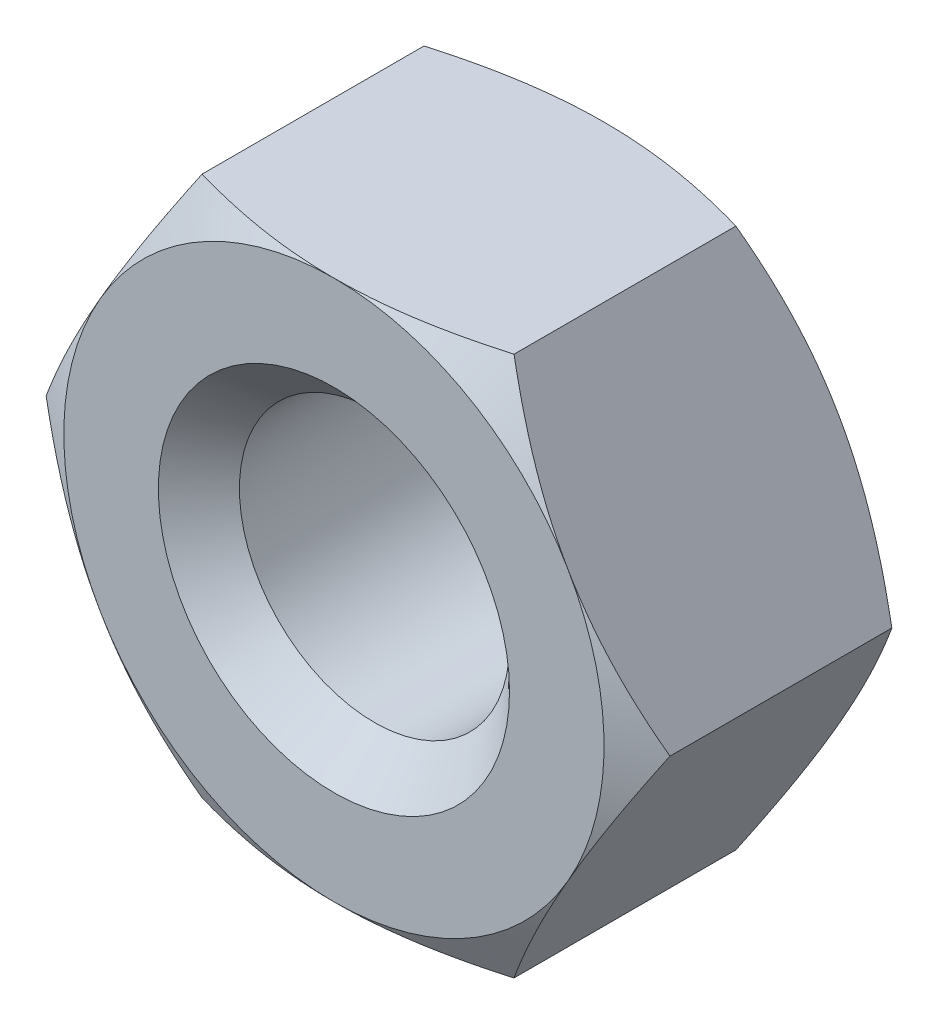
ISO-10303-21;
HEADER;
FILE_DESCRIPTION(('STEP AP214'),'2;1');
FILE_NAME('part.step','',(''),(''),'','','');
FILE_SCHEMA(('AUTOMOTIVE_DESIGN { 1 0 10303 214 1 1 1 1 }'));
ENDSEC;
DATA;
#1=APPLICATION_CONTEXT('core data for automotive mechanical design processes');
#2=APPLICATION_PROTOCOL_DEFINITION('international standard','automotive_design',2000,#1);
#3=PRODUCT_CONTEXT('',#1,'mechanical');
#4=PRODUCT('Part','Part','',(#3));
#5=PRODUCT_RELATED_PRODUCT_CATEGORY('part','',(#4));
#6=PRODUCT_DEFINITION_FORMATION('','',#4);
#7=PRODUCT_DEFINITION_CONTEXT('part definition',#1,'design');
#8=PRODUCT_DEFINITION('design','',#6,#7);
#9=PRODUCT_DEFINITION_SHAPE('','',#8);
#10=(LENGTH_UNIT() NAMED_UNIT(*) SI_UNIT(.MILLI.,.METRE.));
#11=(NAMED_UNIT(*) PLANE_ANGLE_UNIT() SI_UNIT($,.RADIAN.));
#12=(NAMED_UNIT(*) SI_UNIT($,.STERADIAN.) SOLID_ANGLE_UNIT());
#13=UNCERTAINTY_MEASURE_WITH_UNIT(LENGTH_MEASURE(1.E-05),#10,'distance_accuracy_value','');
#14=(GEOMETRIC_REPRESENTATION_CONTEXT(3) GLOBAL_UNCERTAINTY_ASSIGNED_CONTEXT((#13)) GLOBAL_UNIT_ASSIGNED_CONTEXT((#10,
#11,#12)) REPRESENTATION_CONTEXT('',''));
#15=CARTESIAN_POINT('',(0.,0.,0.));
#16=DIRECTION('',(0.,0.,1.));
#17=DIRECTION('',(1.,0.,0.));
#18=AXIS2_PLACEMENT_3D('',#15,#16,#17);
#19=CARTESIAN_POINT('',(2.3094010767585,-4.,4.));
#20=DIRECTION('',(-0.866025403784439,0.5,0.));
#21=DIRECTION('',(-0.5,-0.866025403784439,0.));
#22=AXIS2_PLACEMENT_3D('',#19,#20,#21);
#23=PLANE('',#22);
#24=CARTESIAN_POINT('',(2.30928560670467,-4.0002,3.64266774092523));
#25=CARTESIAN_POINT('',(2.41077174646171,-3.82442084967678,3.70128212635172));
#26=CARTESIAN_POINT('',(2.513133908835,-3.64712438367362,3.75458967853774));
#27=CARTESIAN_POINT('',(2.71963072479812,-3.2894614068243,3.8476383292536));
#28=CARTESIAN_POINT('',(2.82376904741904,-3.10908854102985,3.8873465109703));
#29=CARTESIAN_POINT('',(3.03075510011795,-2.75057818129721,3.94915778471972));
#30=CARTESIAN_POINT('',(3.13357098372492,-2.57249584706486,3.97167226847711));
#31=CARTESIAN_POINT('',(3.33968651028529,-2.21549328283349,3.99854937685342));
#32=CARTESIAN_POINT('',(3.44298540411434,-2.0365743503559,4.00293425857306));
#33=CARTESIAN_POINT('',(3.63600352522933,-1.70225715780327,3.99380992706003));
#34=CARTESIAN_POINT('',(3.72575165335065,-1.54680884001293,3.98254104601201));
#35=CARTESIAN_POINT('',(3.90466320392055,-1.23692494436494,3.94682600920181));
#36=CARTESIAN_POINT('',(3.99382600759479,-1.08249043825587,3.92236765428847));
#37=CARTESIAN_POINT('',(4.17310641015197,-0.771967672225422,3.86122393508071));
#38=CARTESIAN_POINT('',(4.26320131938131,-0.615918711936898,3.82427939634514));
#39=CARTESIAN_POINT('',(4.44204742827551,-0.30614816459616,3.74042992745197));
#40=CARTESIAN_POINT('',(4.53080091904967,-0.15242260922622,3.69354469778726));
#41=CARTESIAN_POINT('',(4.61891762357085,0.000200000000000362,3.64266774092523));
#42=B_SPLINE_CURVE_WITH_KNOTS('',3,(#24,#25,#26,#27,#28,#29,#30,#31,#32,#33,#34,#35,#36,#37,#38,
#39,#40,#41),.UNSPECIFIED.,.F.,.F.,(4,2,2,2,2,2,2,2,4),(0.,0.634047835695967,1.26961969224544,
1.88946157213122,2.50854226669297,3.04757825393386,3.58711366126904,4.13861653143764,
4.68903648037744),.UNSPECIFIED.);
#43=CARTESIAN_POINT('',(2.30940107675851,-4.,3.64273441009184));
#44=VERTEX_POINT('',#43);
#45=CARTESIAN_POINT('',(3.46410161513776,-2.,4.));
#46=VERTEX_POINT('',#45);
#47=EDGE_CURVE('E375',#44,#46,#42,.T.);
#48=ORIENTED_EDGE('',*,*,#47,.F.);
#49=DIRECTION('',(0.,0.,-1.));
#50=VECTOR('',#49,1.);
#51=CARTESIAN_POINT('',(2.3094010767585,-4.,4.));
#52=LINE('',#51,#50);
#53=CARTESIAN_POINT('',(2.3094010767585,-4.,0.357265589908162));
#54=VERTEX_POINT('',#53);
#55=EDGE_CURVE('E330',#44,#54,#52,.T.);
#56=ORIENTED_EDGE('',*,*,#55,.T.);
#57=CARTESIAN_POINT('',(4.61891762357085,0.000200000000000434,0.357332259074766));
#58=CARTESIAN_POINT('',(4.51743148381381,-0.175579150323228,0.298717873648282));
#59=CARTESIAN_POINT('',(4.41506932144052,-0.352875616326381,0.245410321462262));
#60=CARTESIAN_POINT('',(4.2085725054774,-0.710538593175707,0.152361670746403));
#61=CARTESIAN_POINT('',(4.10443418285647,-0.890911458970152,0.112653489029703));
#62=CARTESIAN_POINT('',(3.89744813015756,-1.24942181870279,0.0508422152802782));
#63=CARTESIAN_POINT('',(3.7946322465506,-1.42750415293514,0.028327731522888));
#64=CARTESIAN_POINT('',(3.58851671999023,-1.78450671716651,0.00145062314658105));
#65=CARTESIAN_POINT('',(3.48521782616117,-1.9634256496441,-0.00293425857305752));
#66=CARTESIAN_POINT('',(3.29219970504619,-2.29774284219673,0.00619007293996952));
#67=CARTESIAN_POINT('',(3.20245157692487,-2.45319115998707,0.0174589539879935));
#68=CARTESIAN_POINT('',(3.02354002635497,-2.76307505563506,0.0531739907981925));
#69=CARTESIAN_POINT('',(2.93437722268073,-2.91750956174413,0.0776323457115324));
#70=CARTESIAN_POINT('',(2.75509682012354,-3.22803232777458,0.138776064919289));
#71=CARTESIAN_POINT('',(2.6650019108942,-3.38408128806311,0.175720603654863));
#72=CARTESIAN_POINT('',(2.48615580200001,-3.69385183540384,0.259570072548026));
#73=CARTESIAN_POINT('',(2.39740231122585,-3.84757739077378,0.306455302212739));
#74=CARTESIAN_POINT('',(2.30928560670467,-4.0002,0.357332259074766));
#75=B_SPLINE_CURVE_WITH_KNOTS('',3,(#57,#58,#59,#60,#61,#62,#63,#64,#65,#66,#67,#68,#69,#70,#71,
#72,#73,#74),.UNSPECIFIED.,.F.,.F.,(4,2,2,2,2,2,2,2,4),(0.,0.634047835695967,1.26961969224543,
1.88946157213122,2.50854226669297,3.04757825393386,3.58711366126904,4.13861653143764,
4.68903648037744),.UNSPECIFIED.);
#76=CARTESIAN_POINT('',(3.46410161513776,-2.,0.));
#77=VERTEX_POINT('',#76);
#78=EDGE_CURVE('E268',#77,#54,#75,.T.);
#79=ORIENTED_EDGE('',*,*,#78,.F.);
#80=CARTESIAN_POINT('',(4.61880215351701,0.,0.357265589908162));
#81=VERTEX_POINT('',#80);
#82=EDGE_CURVE('E277',#81,#77,#75,.T.);
#83=ORIENTED_EDGE('',*,*,#82,.F.);
#84=DIRECTION('',(0.,0.,-1.));
#85=VECTOR('',#84,1.);
#86=CARTESIAN_POINT('',(4.61880215351701,0.,4.));
#87=LINE('',#86,#85);
#88=CARTESIAN_POINT('',(4.61880215351701,0.,3.64273441009184));
#89=VERTEX_POINT('',#88);
#90=EDGE_CURVE('E321',#89,#81,#87,.T.);
#91=ORIENTED_EDGE('',*,*,#90,.F.);
#92=EDGE_CURVE('E226',#46,#89,#42,.T.);
#93=ORIENTED_EDGE('',*,*,#92,.F.);
#94=EDGE_LOOP('',(#48,#56,#79,#83,#91,#93));
#95=FACE_BOUND('',#94,.T.);
#96=ADVANCED_FACE('F71',(#95),#23,.F.);
#97=CARTESIAN_POINT('',(4.61880215351701,0.,4.));
#98=DIRECTION('',(-0.866025403784439,-0.5,0.));
#99=DIRECTION('',(0.5,-0.866025403784439,0.));
#100=AXIS2_PLACEMENT_3D('',#97,#98,#99);
#101=PLANE('',#100);
#102=CARTESIAN_POINT('',(4.61891762357085,-0.000199999999999605,3.64266774092523));
#103=CARTESIAN_POINT('',(4.51743148381381,0.175579150323228,3.70128212635172));
#104=CARTESIAN_POINT('',(4.41506932144052,0.352875616326382,3.75458967853774));
#105=CARTESIAN_POINT('',(4.2085725054774,0.710538593175708,3.8476383292536));
#106=CARTESIAN_POINT('',(4.10443418285647,0.890911458970153,3.8873465109703));
#107=CARTESIAN_POINT('',(3.89744813015756,1.24942181870279,3.94915778471972));
#108=CARTESIAN_POINT('',(3.7946322465506,1.42750415293514,3.97167226847711));
#109=CARTESIAN_POINT('',(3.58851671999023,1.78450671716651,3.99854937685342));
#110=CARTESIAN_POINT('',(3.48521782616117,1.9634256496441,4.00293425857306));
#111=CARTESIAN_POINT('',(3.29219970504619,2.29774284219673,3.99380992706003));
#112=CARTESIAN_POINT('',(3.20245157692487,2.45319115998707,3.98254104601201));
#113=CARTESIAN_POINT('',(3.02354002635497,2.76307505563506,3.94682600920181));
#114=CARTESIAN_POINT('',(2.93437722268073,2.91750956174413,3.92236765428847));
#115=CARTESIAN_POINT('',(2.75509682012354,3.22803232777458,3.86122393508071));
#116=CARTESIAN_POINT('',(2.6650019108942,3.38408128806311,3.82427939634514));
#117=CARTESIAN_POINT('',(2.48615580200001,3.69385183540384,3.74042992745197));
#118=CARTESIAN_POINT('',(2.39740231122585,3.84757739077378,3.69354469778726));
#119=CARTESIAN_POINT('',(2.30928560670467,4.0002,3.64266774092523));
#120=B_SPLINE_CURVE_WITH_KNOTS('',3,(#102,#103,#104,#105,#106,#107,#108,#109,#110,#111,#112,
#113,#114,#115,#116,#117,#118,#119),.UNSPECIFIED.,.F.,.F.,(4,2,2,2,2,2,2,2,4),(0.,
0.634047835695967,1.26961969224544,1.88946157213122,2.50854226669297,3.04757825393386,
3.58711366126904,4.13861653143764,4.68903648037744),.UNSPECIFIED.);
#121=CARTESIAN_POINT('',(3.46410161513776,2.,4.));
#122=VERTEX_POINT('',#121);
#123=EDGE_CURVE('E378',#89,#122,#120,.T.);
#124=ORIENTED_EDGE('',*,*,#123,.F.);
#125=ORIENTED_EDGE('',*,*,#90,.T.);
#126=CARTESIAN_POINT('',(2.30928560670467,4.0002,0.357332259074766));
#127=CARTESIAN_POINT('',(2.41077174646171,3.82442084967678,0.298717873648282));
#128=CARTESIAN_POINT('',(2.513133908835,3.64712438367362,0.245410321462262));
#129=CARTESIAN_POINT('',(2.71963072479812,3.2894614068243,0.152361670746403));
#130=CARTESIAN_POINT('',(2.82376904741904,3.10908854102985,0.112653489029704));
#131=CARTESIAN_POINT('',(3.03075510011795,2.75057818129721,0.0508422152802785));
#132=CARTESIAN_POINT('',(3.13357098372492,2.57249584706486,0.0283277315228884));
#133=CARTESIAN_POINT('',(3.33968651028529,2.21549328283349,0.00145062314658142));
#134=CARTESIAN_POINT('',(3.44298540411434,2.0365743503559,-0.00293425857305715));
#135=CARTESIAN_POINT('',(3.63600352522933,1.70225715780327,0.00619007293996989));
#136=CARTESIAN_POINT('',(3.72575165335065,1.54680884001294,0.0174589539879938));
#137=CARTESIAN_POINT('',(3.90466320392055,1.23692494436495,0.0531739907981925));
#138=CARTESIAN_POINT('',(3.99382600759479,1.08249043825587,0.0776323457115322));
#139=CARTESIAN_POINT('',(4.17310641015197,0.771967672225423,0.138776064919288));
#140=CARTESIAN_POINT('',(4.26320131938131,0.615918711936898,0.175720603654863));
#141=CARTESIAN_POINT('',(4.44204742827551,0.306148164596161,0.259570072548026));
#142=CARTESIAN_POINT('',(4.53080091904967,0.152422609226221,0.306455302212739));
#143=CARTESIAN_POINT('',(4.61891762357085,-0.000199999999999611,0.357332259074766));
#144=B_SPLINE_CURVE_WITH_KNOTS('',3,(#126,#127,#128,#129,#130,#131,#132,#133,#134,#135,#136,
#137,#138,#139,#140,#141,#142,#143),.UNSPECIFIED.,.F.,.F.,(4,2,2,2,2,2,2,2,4),(0.,
0.634047835695966,1.26961969224543,1.88946157213122,2.50854226669297,3.04757825393386,
3.58711366126904,4.13861653143764,4.68903648037743),.UNSPECIFIED.);
#145=CARTESIAN_POINT('',(3.46410161513776,2.,0.));
#146=VERTEX_POINT('',#145);
#147=EDGE_CURVE('E340',#146,#81,#144,.T.);
#148=ORIENTED_EDGE('',*,*,#147,.F.);
#149=CARTESIAN_POINT('',(2.30940107675851,4.,0.357265589908162));
#150=VERTEX_POINT('',#149);
#151=EDGE_CURVE('E346',#150,#146,#144,.T.);
#152=ORIENTED_EDGE('',*,*,#151,.F.);
#153=DIRECTION('',(0.,0.,-1.));
#154=VECTOR('',#153,1.);
#155=CARTESIAN_POINT('',(2.3094010767585,4.,4.));
#156=LINE('',#155,#154);
#157=CARTESIAN_POINT('',(2.3094010767585,4.,3.64273441009184));
#158=VERTEX_POINT('',#157);
#159=EDGE_CURVE('E323',#158,#150,#156,.T.);
#160=ORIENTED_EDGE('',*,*,#159,.F.);
#161=EDGE_CURVE('E165',#122,#158,#120,.T.);
#162=ORIENTED_EDGE('',*,*,#161,.F.);
#163=EDGE_LOOP('',(#124,#125,#148,#152,#160,#162));
#164=FACE_BOUND('',#163,.T.);
#165=ADVANCED_FACE('F286',(#164),#101,.F.);
#166=CARTESIAN_POINT('',(2.3094010767585,4.,4.));
#167=DIRECTION('',(0.,-1.,0.));
#168=DIRECTION('',(1.,0.,0.));
#169=AXIS2_PLACEMENT_3D('',#166,#167,#168);
#170=PLANE('',#169);
#171=CARTESIAN_POINT('',(8.22377281979205,4.,1.02955135062835));
#172=CARTESIAN_POINT('',(8.03223273080133,4.,1.1289846895539));
#173=CARTESIAN_POINT('',(7.84042918719807,4.,1.22791473954286));
#174=CARTESIAN_POINT('',(7.45617172379772,4.,1.4245106162138));
#175=CARTESIAN_POINT('',(7.26371779353484,4.,1.52217642242869));
#176=CARTESIAN_POINT('',(6.87773759555663,4.,1.71613603944664));
#177=CARTESIAN_POINT('',(6.68421011399765,4.,1.81242743871128));
#178=CARTESIAN_POINT('',(6.29622349554613,4.,2.00312424142707));
#179=CARTESIAN_POINT('',(6.10176434597207,4.,2.09752961911542));
#180=CARTESIAN_POINT('',(5.70090690298512,4.,2.2891604037035));
#181=CARTESIAN_POINT('',(5.4944444439711,4.,2.38625194782405));
#182=CARTESIAN_POINT('',(5.07998278646949,4.,2.57708350420792));
#183=CARTESIAN_POINT('',(4.87198365981443,4.,2.67082367195227));
#184=CARTESIAN_POINT('',(4.45421086573083,4.,2.85389868812487));
#185=CARTESIAN_POINT('',(4.24443846805704,4.,2.94323641984131));
#186=CARTESIAN_POINT('',(3.82248793412173,4.,3.11621359147475));
#187=CARTESIAN_POINT('',(3.6103092807322,4.,3.1998517783575));
#188=CARTESIAN_POINT('',(3.15575008619474,4.,3.36973257780067));
#189=CARTESIAN_POINT('',(2.91297839033453,4.,3.45493951448985));
#190=CARTESIAN_POINT('',(2.42312281023466,4.,3.61186672303589));
#191=CARTESIAN_POINT('',(2.17604109194806,4.,3.68359356726142));
#192=CARTESIAN_POINT('',(1.80441100936608,4.,3.77669459347473));
#193=CARTESIAN_POINT('',(1.681618614227,4.,3.80509564668338));
#194=CARTESIAN_POINT('',(1.43495449455431,4.,3.8567912045385));
#195=CARTESIAN_POINT('',(1.31108279228523,4.,3.88008581426535));
#196=CARTESIAN_POINT('',(1.06244370053288,4.,3.920915042648));
#197=CARTESIAN_POINT('',(0.93767674770002,4.,3.93845229700572));
#198=CARTESIAN_POINT('',(0.687419203995834,4.,3.9672144227395));
#199=CARTESIAN_POINT('',(0.561928669093851,4.,3.97843977589808));
#200=CARTESIAN_POINT('',(0.30854989326107,4.,3.99429847771105));
#201=CARTESIAN_POINT('',(0.180654916097408,4.,3.99882567497923));
#202=CARTESIAN_POINT('',(-0.0751887615497096,4.,4.00077297180769));
#203=CARTESIAN_POINT('',(-0.203137461831747,4.,3.99819309777989));
#204=CARTESIAN_POINT('',(-0.458726952854563,4.,3.98602656838484));
#205=CARTESIAN_POINT('',(-0.586367669796711,4.,3.976438374232));
#206=CARTESIAN_POINT('',(-0.840965778949304,4.,3.95062349190664));
#207=CARTESIAN_POINT('',(-0.967923152449589,4.,3.93439662289248));
#208=CARTESIAN_POINT('',(-1.35268609920447,4.,3.87576128823781));
#209=CARTESIAN_POINT('',(-1.60904019800144,4.,3.82368727018804));
#210=CARTESIAN_POINT('',(-2.11687147737325,4.,3.69994012141528));
#211=CARTESIAN_POINT('',(-2.36834661633693,4.,3.628258967725));
#212=CARTESIAN_POINT('',(-2.8697004662967,4.,3.46976028499574));
#213=CARTESIAN_POINT('',(-3.11952445743986,4.,3.38277258739808));
#214=CARTESIAN_POINT('',(-3.61534009228423,4.,3.19841412917322));
#215=CARTESIAN_POINT('',(-3.86133054275174,4.,3.10104020688007));
#216=CARTESIAN_POINT('',(-4.35053173395208,4.,2.89873175315196));
#217=CARTESIAN_POINT('',(-4.59373843461281,4.,2.79378753457126));
#218=CARTESIAN_POINT('',(-5.07769199435738,4.,2.57848518445966));
#219=CARTESIAN_POINT('',(-5.31843916092274,4.,2.46812773992954));
#220=CARTESIAN_POINT('',(-5.78333399206802,4.,2.25026747803404));
#221=CARTESIAN_POINT('',(-6.00759448460543,4.,2.14300441753181));
#222=CARTESIAN_POINT('',(-6.45478798454367,4.,1.92572996223252));
#223=CARTESIAN_POINT('',(-6.67772093962012,4.,1.815718459983));
#224=CARTESIAN_POINT('',(-7.12167554474106,4.,1.59396966777827));
#225=CARTESIAN_POINT('',(-7.34270123119368,4.,1.48224044001679));
#226=CARTESIAN_POINT('',(-7.78385646628386,4.,1.25707542908476));
#227=CARTESIAN_POINT('',(-8.00398609608636,4.,1.14363980505646));
#228=CARTESIAN_POINT('',(-8.22377281979205,4.,1.02955135062835));
#229=B_SPLINE_CURVE_WITH_KNOTS('',3,(#171,#172,#173,#174,#175,#176,#177,#178,#179,#180,#181,
#182,#183,#184,#185,#186,#187,#188,#189,#190,#191,#192,#193,#194,#195,#196,#197,#198,#199,#200,
#201,#202,#203,#204,#205,#206,#207,#208,#209,#210,#211,#212,#213,#214,#215,#216,#217,#218,#219,
#220,#221,#222,#223,#224,#225,#226,#227,#228),.UNSPECIFIED.,.F.,.F.,(4,2,2,2,2,2,2,2,2,2,2,2,2,
2,2,2,2,2,2,2,2,2,2,2,2,2,2,2,4),(0.,0.647436580634127,1.29488362967439,1.94335363455069,
2.59183249139284,3.27626652920359,3.96066877262438,4.64461665515795,5.32871442045929,
6.1003299186488,6.87156822556521,7.24958208425106,7.62758816343967,8.00542095035357,
8.38322489366805,8.76695437316975,9.15068242662418,9.53449475885397,9.91831754706729,
10.7019388399655,11.4858812607103,12.2791640647166,13.0726890445061,13.867248095332,
14.6617065670478,15.4074605341621,16.1532437028724,16.8962174899114,17.6391224099762),.UNSPECIFIED.);
#230=CARTESIAN_POINT('',(0.,4.,4.));
#231=VERTEX_POINT('',#230);
#232=EDGE_CURVE('E161',#158,#231,#229,.T.);
#233=ORIENTED_EDGE('',*,*,#232,.F.);
#234=ORIENTED_EDGE('',*,*,#159,.T.);
#235=CARTESIAN_POINT('',(-8.22377281979205,4.,2.97044864937165));
#236=CARTESIAN_POINT('',(-8.03223273080133,4.,2.8710153104461));
#237=CARTESIAN_POINT('',(-7.84042918719807,4.,2.77208526045714));
#238=CARTESIAN_POINT('',(-7.45617172379772,4.,2.5754893837862));
#239=CARTESIAN_POINT('',(-7.26371779353484,4.,2.47782357757131));
#240=CARTESIAN_POINT('',(-6.87773759555663,4.,2.28386396055336));
#241=CARTESIAN_POINT('',(-6.68421011399765,4.,2.18757256128872));
#242=CARTESIAN_POINT('',(-6.29622349554614,4.,1.99687575857293));
#243=CARTESIAN_POINT('',(-6.10176434597207,4.,1.90247038088458));
#244=CARTESIAN_POINT('',(-5.70090690298512,4.,1.7108395962965));
#245=CARTESIAN_POINT('',(-5.4944444439711,4.,1.61374805217595));
#246=CARTESIAN_POINT('',(-5.07998278646949,4.,1.42291649579208));
#247=CARTESIAN_POINT('',(-4.87198365981443,4.,1.32917632804773));
#248=CARTESIAN_POINT('',(-4.45421086573084,4.,1.14610131187513));
#249=CARTESIAN_POINT('',(-4.24443846805705,4.,1.05676358015869));
#250=CARTESIAN_POINT('',(-3.82248793412174,4.,0.88378640852525));
#251=CARTESIAN_POINT('',(-3.6103092807322,4.,0.800148221642497));
#252=CARTESIAN_POINT('',(-3.15575008619475,4.,0.630267422199328));
#253=CARTESIAN_POINT('',(-2.91297839033454,4.,0.54506048551015));
#254=CARTESIAN_POINT('',(-2.42312281023467,4.,0.388133276964106));
#255=CARTESIAN_POINT('',(-2.17604109194807,4.,0.316406432738583));
#256=CARTESIAN_POINT('',(-1.80441100936608,4.,0.223305406525269));
#257=CARTESIAN_POINT('',(-1.68161861422701,4.,0.194904353316625));
#258=CARTESIAN_POINT('',(-1.43495449455432,4.,0.143208795461497));
#259=CARTESIAN_POINT('',(-1.31108279228524,4.,0.119914185734651));
#260=CARTESIAN_POINT('',(-1.06244370053289,4.,0.0790849573519984));
#261=CARTESIAN_POINT('',(-0.937676747700025,4.,0.0615477029942832));
#262=CARTESIAN_POINT('',(-0.68741920399584,4.,0.032785577260503));
#263=CARTESIAN_POINT('',(-0.561928669093857,4.,0.0215602241019221));
#264=CARTESIAN_POINT('',(-0.308549893261076,4.,0.00570152228894804));
#265=CARTESIAN_POINT('',(-0.180654916097414,4.,0.00117432502076664));
#266=CARTESIAN_POINT('',(0.0751887615497029,4.,-0.000772971807693935));
#267=CARTESIAN_POINT('',(0.203137461831741,4.,0.00180690222010461));
#268=CARTESIAN_POINT('',(0.458726952854557,4.,0.0139734316151613));
#269=CARTESIAN_POINT('',(0.586367669796705,4.,0.0235616257680019));
#270=CARTESIAN_POINT('',(0.840965778949298,4.,0.0493765080933587));
#271=CARTESIAN_POINT('',(0.967923152449584,4.,0.0656033771075189));
#272=CARTESIAN_POINT('',(1.35268609920446,4.,0.124238711762189));
#273=CARTESIAN_POINT('',(1.60904019800144,4.,0.176312729811961));
#274=CARTESIAN_POINT('',(2.11687147737324,4.,0.300059878584719));
#275=CARTESIAN_POINT('',(2.36834661633693,4.,0.371741032274999));
#276=CARTESIAN_POINT('',(2.86970046629669,4.,0.530239715004258));
#277=CARTESIAN_POINT('',(3.11952445743986,4.,0.617227412601922));
#278=CARTESIAN_POINT('',(3.61534009228422,4.,0.80158587082678));
#279=CARTESIAN_POINT('',(3.86133054275173,4.,0.898959793119928));
#280=CARTESIAN_POINT('',(4.35053173395208,4.,1.10126824684803));
#281=CARTESIAN_POINT('',(4.5937384346128,4.,1.20621246542874));
#282=CARTESIAN_POINT('',(5.07769199435737,4.,1.42151481554033));
#283=CARTESIAN_POINT('',(5.31843916092273,4.,1.53187226007046));
#284=CARTESIAN_POINT('',(5.78333399206801,4.,1.74973252196596));
#285=CARTESIAN_POINT('',(6.00759448460542,4.,1.85699558246818));
#286=CARTESIAN_POINT('',(6.45478798454366,4.,2.07427003776747));
#287=CARTESIAN_POINT('',(6.67772093962011,4.,2.184281540017));
#288=CARTESIAN_POINT('',(7.12167554474106,4.,2.40603033222173));
#289=CARTESIAN_POINT('',(7.34270123119367,4.,2.51775955998321));
#290=CARTESIAN_POINT('',(7.78385646628386,4.,2.74292457091523));
#291=CARTESIAN_POINT('',(8.00398609608635,4.,2.85636019494354));
#292=CARTESIAN_POINT('',(8.22377281979205,4.,2.97044864937165));
#293=B_SPLINE_CURVE_WITH_KNOTS('',3,(#235,#236,#237,#238,#239,#240,#241,#242,#243,#244,#245,
#246,#247,#248,#249,#250,#251,#252,#253,#254,#255,#256,#257,#258,#259,#260,#261,#262,#263,#264,
#265,#266,#267,#268,#269,#270,#271,#272,#273,#274,#275,#276,#277,#278,#279,#280,#281,#282,#283,
#284,#285,#286,#287,#288,#289,#290,#291,#292),.UNSPECIFIED.,.F.,.F.,(4,2,2,2,2,2,2,2,2,2,2,2,2,
2,2,2,2,2,2,2,2,2,2,2,2,2,2,2,4),(0.,0.647436580634127,1.29488362967439,1.94335363455069,
2.59183249139284,3.27626652920359,3.96066877262438,4.64461665515795,5.32871442045929,
6.1003299186488,6.87156822556521,7.24958208425105,7.62758816343966,8.00542095035357,
8.38322489366805,8.76695437316974,9.15068242662418,9.53449475885396,9.91831754706729,
10.7019388399655,11.4858812607103,12.2791640647166,13.0726890445061,13.867248095332,
14.6617065670478,15.4074605341621,16.1532437028723,16.8962174899114,17.6391224099762),.UNSPECIFIED.);
#294=CARTESIAN_POINT('',(0.,4.,0.));
#295=VERTEX_POINT('',#294);
#296=EDGE_CURVE('E333',#295,#150,#293,.T.);
#297=ORIENTED_EDGE('',*,*,#296,.F.);
#298=CARTESIAN_POINT('',(-2.30940107675851,4.,0.357265589908162));
#299=VERTEX_POINT('',#298);
#300=EDGE_CURVE('E332',#299,#295,#293,.T.);
#301=ORIENTED_EDGE('',*,*,#300,.F.);
#302=DIRECTION('',(0.,0.,-1.));
#303=VECTOR('',#302,1.);
#304=CARTESIAN_POINT('',(-2.30940107675851,4.,4.));
#305=LINE('',#304,#303);
#306=CARTESIAN_POINT('',(-2.30940107675851,4.,3.64273441009184));
#307=VERTEX_POINT('',#306);
#308=EDGE_CURVE('E191',#307,#299,#305,.T.);
#309=ORIENTED_EDGE('',*,*,#308,.F.);
#310=EDGE_CURVE('E169',#231,#307,#229,.T.);
#311=ORIENTED_EDGE('',*,*,#310,.F.);
#312=EDGE_LOOP('',(#233,#234,#297,#301,#309,#311));
#313=FACE_BOUND('',#312,.T.);
#314=ADVANCED_FACE('F189',(#313),#170,.F.);
#315=CARTESIAN_POINT('',(-2.30940107675851,4.,4.));
#316=DIRECTION('',(0.866025403784439,-0.5,0.));
#317=DIRECTION('',(0.5,0.866025403784439,0.));
#318=AXIS2_PLACEMENT_3D('',#315,#316,#317);
#319=PLANE('',#318);
#320=CARTESIAN_POINT('',(-2.30928560670467,4.0002,3.64266774092523));
#321=CARTESIAN_POINT('',(-2.41077174646171,3.82442084967677,3.70128212635172));
#322=CARTESIAN_POINT('',(-2.513133908835,3.64712438367362,3.75458967853774));
#323=CARTESIAN_POINT('',(-2.71963072479812,3.2894614068243,3.8476383292536));
#324=CARTESIAN_POINT('',(-2.82376904741904,3.10908854102985,3.8873465109703));
#325=CARTESIAN_POINT('',(-3.03075510011795,2.75057818129721,3.94915778471972));
#326=CARTESIAN_POINT('',(-3.13357098372492,2.57249584706486,3.97167226847711));
#327=CARTESIAN_POINT('',(-3.33968651028529,2.21549328283349,3.99854937685342));
#328=CARTESIAN_POINT('',(-3.44298540411434,2.0365743503559,4.00293425857306));
#329=CARTESIAN_POINT('',(-3.63600352522933,1.70225715780327,3.99380992706003));
#330=CARTESIAN_POINT('',(-3.72575165335065,1.54680884001293,3.98254104601201));
#331=CARTESIAN_POINT('',(-3.90466320392055,1.23692494436495,3.94682600920181));
#332=CARTESIAN_POINT('',(-3.99382600759479,1.08249043825587,3.92236765428847));
#333=CARTESIAN_POINT('',(-4.17310641015197,0.771967672225422,3.86122393508071));
#334=CARTESIAN_POINT('',(-4.26320131938131,0.615918711936898,3.82427939634514));
#335=CARTESIAN_POINT('',(-4.44204742827551,0.30614816459616,3.74042992745197));
#336=CARTESIAN_POINT('',(-4.53080091904966,0.15242260922622,3.69354469778726));
#337=CARTESIAN_POINT('',(-4.61891762357085,-0.000200000000000428,3.64266774092523));
#338=B_SPLINE_CURVE_WITH_KNOTS('',3,(#320,#321,#322,#323,#324,#325,#326,#327,#328,#329,#330,
#331,#332,#333,#334,#335,#336,#337),.UNSPECIFIED.,.F.,.F.,(4,2,2,2,2,2,2,2,4),(0.,
0.634047835695966,1.26961969224543,1.88946157213122,2.50854226669297,3.04757825393386,
3.58711366126903,4.13861653143764,4.68903648037743),.UNSPECIFIED.);
#339=CARTESIAN_POINT('',(-3.46410161513776,2.,4.));
#340=VERTEX_POINT('',#339);
#341=EDGE_CURVE('E176',#307,#340,#338,.T.);
#342=ORIENTED_EDGE('',*,*,#341,.F.);
#343=ORIENTED_EDGE('',*,*,#308,.T.);
#344=CARTESIAN_POINT('',(-4.61891762357085,-0.000200000000000867,0.357332259074765));
#345=CARTESIAN_POINT('',(-4.51743148381381,0.175579150323227,0.298717873648281));
#346=CARTESIAN_POINT('',(-4.41506932144052,0.35287561632638,0.245410321462261));
#347=CARTESIAN_POINT('',(-4.2085725054774,0.710538593175706,0.152361670746402));
#348=CARTESIAN_POINT('',(-4.10443418285647,0.890911458970151,0.112653489029703));
#349=CARTESIAN_POINT('',(-3.89744813015756,1.24942181870279,0.0508422152802781));
#350=CARTESIAN_POINT('',(-3.7946322465506,1.42750415293514,0.0283277315228877));
#351=CARTESIAN_POINT('',(-3.58851671999023,1.78450671716651,0.0014506231465804));
#352=CARTESIAN_POINT('',(-3.48521782616117,1.9634256496441,-0.00293425857305826));
#353=CARTESIAN_POINT('',(-3.29219970504619,2.29774284219673,0.00619007293996898));
#354=CARTESIAN_POINT('',(-3.20245157692487,2.45319115998707,0.0174589539879932));
#355=CARTESIAN_POINT('',(-3.02354002635497,2.76307505563506,0.0531739907981921));
#356=CARTESIAN_POINT('',(-2.93437722268073,2.91750956174413,0.0776323457115318));
#357=CARTESIAN_POINT('',(-2.75509682012354,3.22803232777458,0.138776064919288));
#358=CARTESIAN_POINT('',(-2.6650019108942,3.3840812880631,0.175720603654863));
#359=CARTESIAN_POINT('',(-2.48615580200001,3.69385183540384,0.259570072548027));
#360=CARTESIAN_POINT('',(-2.39740231122585,3.84757739077378,0.30645530221274));
#361=CARTESIAN_POINT('',(-2.30928560670467,4.0002,0.357332259074766));
#362=B_SPLINE_CURVE_WITH_KNOTS('',3,(#344,#345,#346,#347,#348,#349,#350,#351,#352,#353,#354,
#355,#356,#357,#358,#359,#360,#361),.UNSPECIFIED.,.F.,.F.,(4,2,2,2,2,2,2,2,4),(0.,
0.634047835695966,1.26961969224543,1.88946157213122,2.50854226669297,3.04757825393386,
3.58711366126904,4.13861653143764,4.68903648037744),.UNSPECIFIED.);
#363=CARTESIAN_POINT('',(-3.46410161513776,2.,0.));
#364=VERTEX_POINT('',#363);
#365=EDGE_CURVE('E339',#364,#299,#362,.T.);
#366=ORIENTED_EDGE('',*,*,#365,.F.);
#367=CARTESIAN_POINT('',(-4.61880215351701,0.,0.357265589908161));
#368=VERTEX_POINT('',#367);
#369=EDGE_CURVE('E278',#368,#364,#362,.T.);
#370=ORIENTED_EDGE('',*,*,#369,.F.);
#371=DIRECTION('',(0.,0.,-1.));
#372=VECTOR('',#371,1.);
#373=CARTESIAN_POINT('',(-4.61880215351701,0.,4.));
#374=LINE('',#373,#372);
#375=CARTESIAN_POINT('',(-4.61880215351701,0.,3.64273441009184));
#376=VERTEX_POINT('',#375);
#377=EDGE_CURVE('E326',#376,#368,#374,.T.);
#378=ORIENTED_EDGE('',*,*,#377,.F.);
#379=EDGE_CURVE('E192',#340,#376,#338,.T.);
#380=ORIENTED_EDGE('',*,*,#379,.F.);
#381=EDGE_LOOP('',(#342,#343,#366,#370,#378,#380));
#382=FACE_BOUND('',#381,.T.);
#383=ADVANCED_FACE('F254',(#382),#319,.F.);
#384=CARTESIAN_POINT('',(-4.61880215351701,0.,4.));
#385=DIRECTION('',(0.866025403784439,0.5,0.));
#386=DIRECTION('',(-0.5,0.866025403784439,0.));
#387=AXIS2_PLACEMENT_3D('',#384,#385,#386);
#388=PLANE('',#387);
#389=CARTESIAN_POINT('',(-4.61891762357085,0.0001999999999992,3.64266774092523));
#390=CARTESIAN_POINT('',(-4.51743148381381,-0.175579150323229,3.70128212635172));
#391=CARTESIAN_POINT('',(-4.41506932144052,-0.352875616326382,3.75458967853774));
#392=CARTESIAN_POINT('',(-4.2085725054774,-0.710538593175708,3.8476383292536));
#393=CARTESIAN_POINT('',(-4.10443418285647,-0.890911458970152,3.8873465109703));
#394=CARTESIAN_POINT('',(-3.89744813015756,-1.24942181870279,3.94915778471972));
#395=CARTESIAN_POINT('',(-3.7946322465506,-1.42750415293514,3.97167226847711));
#396=CARTESIAN_POINT('',(-3.58851671999023,-1.78450671716651,3.99854937685342));
#397=CARTESIAN_POINT('',(-3.48521782616117,-1.9634256496441,4.00293425857306));
#398=CARTESIAN_POINT('',(-3.29219970504619,-2.29774284219673,3.99380992706003));
#399=CARTESIAN_POINT('',(-3.20245157692487,-2.45319115998707,3.98254104601201));
#400=CARTESIAN_POINT('',(-3.02354002635497,-2.76307505563506,3.94682600920181));
#401=CARTESIAN_POINT('',(-2.93437722268073,-2.91750956174413,3.92236765428847));
#402=CARTESIAN_POINT('',(-2.75509682012354,-3.22803232777458,3.86122393508071));
#403=CARTESIAN_POINT('',(-2.6650019108942,-3.38408128806311,3.82427939634514));
#404=CARTESIAN_POINT('',(-2.48615580200001,-3.69385183540384,3.74042992745197));
#405=CARTESIAN_POINT('',(-2.39740231122585,-3.84757739077378,3.69354469778726));
#406=CARTESIAN_POINT('',(-2.30928560670467,-4.0002,3.64266774092523));
#407=B_SPLINE_CURVE_WITH_KNOTS('',3,(#389,#390,#391,#392,#393,#394,#395,#396,#397,#398,#399,
#400,#401,#402,#403,#404,#405,#406),.UNSPECIFIED.,.F.,.F.,(4,2,2,2,2,2,2,2,4),(0.,
0.634047835695967,1.26961969224543,1.88946157213122,2.50854226669297,3.04757825393386,
3.58711366126904,4.13861653143764,4.68903648037743),.UNSPECIFIED.);
#408=CARTESIAN_POINT('',(-3.46410161513776,-2.,4.));
#409=VERTEX_POINT('',#408);
#410=EDGE_CURVE('E248',#376,#409,#407,.T.);
#411=ORIENTED_EDGE('',*,*,#410,.F.);
#412=ORIENTED_EDGE('',*,*,#377,.T.);
#413=CARTESIAN_POINT('',(-2.30928560670467,-4.0002,0.357332259074766));
#414=CARTESIAN_POINT('',(-2.41077174646171,-3.82442084967678,0.298717873648281));
#415=CARTESIAN_POINT('',(-2.513133908835,-3.64712438367362,0.245410321462262));
#416=CARTESIAN_POINT('',(-2.71963072479812,-3.2894614068243,0.152361670746403));
#417=CARTESIAN_POINT('',(-2.82376904741904,-3.10908854102985,0.112653489029703));
#418=CARTESIAN_POINT('',(-3.03075510011795,-2.75057818129721,0.0508422152802783));
#419=CARTESIAN_POINT('',(-3.13357098372492,-2.57249584706486,0.0283277315228881));
#420=CARTESIAN_POINT('',(-3.33968651028529,-2.21549328283349,0.00145062314658098));
#421=CARTESIAN_POINT('',(-3.44298540411434,-2.0365743503559,-0.00293425857305766));
#422=CARTESIAN_POINT('',(-3.63600352522933,-1.70225715780327,0.0061900729399694));
#423=CARTESIAN_POINT('',(-3.72575165335065,-1.54680884001294,0.0174589539879934));
#424=CARTESIAN_POINT('',(-3.90466320392055,-1.23692494436495,0.0531739907981922));
#425=CARTESIAN_POINT('',(-3.99382600759479,-1.08249043825587,0.0776323457115319));
#426=CARTESIAN_POINT('',(-4.17310641015197,-0.771967672225423,0.138776064919288));
#427=CARTESIAN_POINT('',(-4.26320131938131,-0.615918711936899,0.175720603654862));
#428=CARTESIAN_POINT('',(-4.44204742827551,-0.306148164596162,0.259570072548026));
#429=CARTESIAN_POINT('',(-4.53080091904967,-0.152422609226222,0.306455302212739));
#430=CARTESIAN_POINT('',(-4.61891762357085,0.000199999999999304,0.357332259074765));
#431=B_SPLINE_CURVE_WITH_KNOTS('',3,(#413,#414,#415,#416,#417,#418,#419,#420,#421,#422,#423,
#424,#425,#426,#427,#428,#429,#430),.UNSPECIFIED.,.F.,.F.,(4,2,2,2,2,2,2,2,4),(0.,
0.634047835695966,1.26961969224543,1.88946157213122,2.50854226669297,3.04757825393386,
3.58711366126904,4.13861653143764,4.68903648037743),.UNSPECIFIED.);
#432=CARTESIAN_POINT('',(-3.46410161513776,-2.,0.));
#433=VERTEX_POINT('',#432);
#434=EDGE_CURVE('E270',#433,#368,#431,.T.);
#435=ORIENTED_EDGE('',*,*,#434,.F.);
#436=CARTESIAN_POINT('',(-2.30940107675851,-4.,0.357265589908157));
#437=VERTEX_POINT('',#436);
#438=EDGE_CURVE('E261',#437,#433,#431,.T.);
#439=ORIENTED_EDGE('',*,*,#438,.F.);
#440=DIRECTION('',(0.,0.,-1.));
#441=VECTOR('',#440,1.);
#442=CARTESIAN_POINT('',(-2.3094010767585,-4.,4.));
#443=LINE('',#442,#441);
#444=CARTESIAN_POINT('',(-2.3094010767585,-4.,3.64273441009184));
#445=VERTEX_POINT('',#444);
#446=EDGE_CURVE('E328',#445,#437,#443,.T.);
#447=ORIENTED_EDGE('',*,*,#446,.F.);
#448=EDGE_CURVE('E242',#409,#445,#407,.T.);
#449=ORIENTED_EDGE('',*,*,#448,.F.);
#450=EDGE_LOOP('',(#411,#412,#435,#439,#447,#449));
#451=FACE_BOUND('',#450,.T.);
#452=ADVANCED_FACE('F250',(#451),#388,.F.);
#453=CARTESIAN_POINT('',(-2.3094010767585,-4.,4.));
#454=DIRECTION('',(0.,1.,0.));
#455=DIRECTION('',(0.,0.,1.));
#456=AXIS2_PLACEMENT_3D('',#453,#454,#455);
#457=PLANE('',#456);
#458=CARTESIAN_POINT('',(-8.22377281979205,-4.,1.02955135062835));
#459=CARTESIAN_POINT('',(-8.03223273080133,-4.,1.1289846895539));
#460=CARTESIAN_POINT('',(-7.84042918719807,-4.,1.22791473954286));
#461=CARTESIAN_POINT('',(-7.45617172379772,-4.,1.4245106162138));
#462=CARTESIAN_POINT('',(-7.26371779353484,-4.,1.52217642242869));
#463=CARTESIAN_POINT('',(-6.87773759555663,-4.,1.71613603944663));
#464=CARTESIAN_POINT('',(-6.68421011399765,-4.,1.81242743871128));
#465=CARTESIAN_POINT('',(-6.29622349554614,-4.,2.00312424142707));
#466=CARTESIAN_POINT('',(-6.10176434597207,-4.,2.09752961911542));
#467=CARTESIAN_POINT('',(-5.70090690298512,-4.,2.2891604037035));
#468=CARTESIAN_POINT('',(-5.4944444439711,-4.,2.38625194782405));
#469=CARTESIAN_POINT('',(-5.07998278646949,-4.,2.57708350420792));
#470=CARTESIAN_POINT('',(-4.87198365981443,-4.,2.67082367195227));
#471=CARTESIAN_POINT('',(-4.45421086573084,-4.,2.85389868812487));
#472=CARTESIAN_POINT('',(-4.24443846805705,-4.,2.94323641984131));
#473=CARTESIAN_POINT('',(-3.82248793412173,-4.,3.11621359147475));
#474=CARTESIAN_POINT('',(-3.6103092807322,-4.,3.1998517783575));
#475=CARTESIAN_POINT('',(-3.15575008619474,-4.,3.36973257780067));
#476=CARTESIAN_POINT('',(-2.91297839033453,-4.,3.45493951448985));
#477=CARTESIAN_POINT('',(-2.42312281023466,-4.,3.61186672303589));
#478=CARTESIAN_POINT('',(-2.17604109194806,-4.,3.68359356726142));
#479=CARTESIAN_POINT('',(-1.80441100936608,-4.,3.77669459347473));
#480=CARTESIAN_POINT('',(-1.681618614227,-4.,3.80509564668338));
#481=CARTESIAN_POINT('',(-1.43495449455431,-4.,3.8567912045385));
#482=CARTESIAN_POINT('',(-1.31108279228523,-4.,3.88008581426535));
#483=CARTESIAN_POINT('',(-1.06244370053288,-4.,3.920915042648));
#484=CARTESIAN_POINT('',(-0.93767674770002,-4.,3.93845229700572));
#485=CARTESIAN_POINT('',(-0.687419203995834,-4.,3.9672144227395));
#486=CARTESIAN_POINT('',(-0.561928669093851,-4.,3.97843977589808));
#487=CARTESIAN_POINT('',(-0.308549893261069,-4.,3.99429847771105));
#488=CARTESIAN_POINT('',(-0.180654916097408,-4.,3.99882567497923));
#489=CARTESIAN_POINT('',(0.0751887615497098,-4.,4.00077297180769));
#490=CARTESIAN_POINT('',(0.203137461831748,-4.,3.99819309777989));
#491=CARTESIAN_POINT('',(0.458726952854564,-4.,3.98602656838484));
#492=CARTESIAN_POINT('',(0.586367669796711,-4.,3.976438374232));
#493=CARTESIAN_POINT('',(0.840965778949304,-4.,3.95062349190664));
#494=CARTESIAN_POINT('',(0.96792315244959,-4.,3.93439662289248));
#495=CARTESIAN_POINT('',(1.35268609920447,-4.,3.87576128823781));
#496=CARTESIAN_POINT('',(1.60904019800144,-4.,3.82368727018804));
#497=CARTESIAN_POINT('',(2.11687147737325,-4.,3.69994012141528));
#498=CARTESIAN_POINT('',(2.36834661633694,-4.,3.628258967725));
#499=CARTESIAN_POINT('',(2.8697004662967,-4.,3.46976028499574));
#500=CARTESIAN_POINT('',(3.11952445743986,-4.,3.38277258739808));
#501=CARTESIAN_POINT('',(3.61534009228423,-4.,3.19841412917322));
#502=CARTESIAN_POINT('',(3.86133054275174,-4.,3.10104020688007));
#503=CARTESIAN_POINT('',(4.35053173395208,-4.,2.89873175315196));
#504=CARTESIAN_POINT('',(4.59373843461281,-4.,2.79378753457126));
#505=CARTESIAN_POINT('',(5.07769199435738,-4.,2.57848518445966));
#506=CARTESIAN_POINT('',(5.31843916092274,-4.,2.46812773992954));
#507=CARTESIAN_POINT('',(5.78333399206802,-4.,2.25026747803404));
#508=CARTESIAN_POINT('',(6.00759448460543,-4.,2.14300441753181));
#509=CARTESIAN_POINT('',(6.45478798454367,-4.,1.92572996223253));
#510=CARTESIAN_POINT('',(6.67772093962011,-4.,1.815718459983));
#511=CARTESIAN_POINT('',(7.12167554474106,-4.,1.59396966777827));
#512=CARTESIAN_POINT('',(7.34270123119368,-4.,1.48224044001679));
#513=CARTESIAN_POINT('',(7.78385646628386,-4.,1.25707542908476));
#514=CARTESIAN_POINT('',(8.00398609608635,-4.,1.14363980505646));
#515=CARTESIAN_POINT('',(8.22377281979205,-4.,1.02955135062835));
#516=B_SPLINE_CURVE_WITH_KNOTS('',3,(#458,#459,#460,#461,#462,#463,#464,#465,#466,#467,#468,
#469,#470,#471,#472,#473,#474,#475,#476,#477,#478,#479,#480,#481,#482,#483,#484,#485,#486,#487,
#488,#489,#490,#491,#492,#493,#494,#495,#496,#497,#498,#499,#500,#501,#502,#503,#504,#505,#506,
#507,#508,#509,#510,#511,#512,#513,#514,#515),.UNSPECIFIED.,.F.,.F.,(4,2,2,2,2,2,2,2,2,2,2,2,2,
2,2,2,2,2,2,2,2,2,2,2,2,2,2,2,4),(0.,0.647436580634127,1.29488362967439,1.94335363455069,
2.59183249139284,3.27626652920359,3.96066877262438,4.64461665515795,5.32871442045929,
6.1003299186488,6.87156822556521,7.24958208425106,7.62758816343967,8.00542095035357,
8.38322489366805,8.76695437316975,9.15068242662418,9.53449475885396,9.91831754706729,
10.7019388399655,11.4858812607103,12.2791640647166,13.0726890445061,13.867248095332,
14.6617065670478,15.4074605341621,16.1532437028723,16.8962174899114,17.6391224099762),.UNSPECIFIED.);
#517=CARTESIAN_POINT('',(0.,-4.,4.));
#518=VERTEX_POINT('',#517);
#519=EDGE_CURVE('E249',#445,#518,#516,.T.);
#520=ORIENTED_EDGE('',*,*,#519,.F.);
#521=ORIENTED_EDGE('',*,*,#446,.T.);
#522=CARTESIAN_POINT('',(8.22377281979205,-4.,2.97044864937165));
#523=CARTESIAN_POINT('',(8.03223273080133,-4.,2.8710153104461));
#524=CARTESIAN_POINT('',(7.84042918719807,-4.,2.77208526045714));
#525=CARTESIAN_POINT('',(7.45617172379772,-4.,2.5754893837862));
#526=CARTESIAN_POINT('',(7.26371779353484,-4.,2.47782357757131));
#527=CARTESIAN_POINT('',(6.87773759555663,-4.,2.28386396055336));
#528=CARTESIAN_POINT('',(6.68421011399765,-4.,2.18757256128872));
#529=CARTESIAN_POINT('',(6.29622349554613,-4.,1.99687575857293));
#530=CARTESIAN_POINT('',(6.10176434597206,-4.,1.90247038088458));
#531=CARTESIAN_POINT('',(5.70090690298512,-4.,1.7108395962965));
#532=CARTESIAN_POINT('',(5.4944444439711,-4.,1.61374805217595));
#533=CARTESIAN_POINT('',(5.07998278646949,-4.,1.42291649579208));
#534=CARTESIAN_POINT('',(4.87198365981443,-4.,1.32917632804773));
#535=CARTESIAN_POINT('',(4.45421086573083,-4.,1.14610131187513));
#536=CARTESIAN_POINT('',(4.24443846805705,-4.,1.05676358015869));
#537=CARTESIAN_POINT('',(3.82248793412173,-4.,0.883786408525249));
#538=CARTESIAN_POINT('',(3.6103092807322,-4.,0.800148221642496));
#539=CARTESIAN_POINT('',(3.15575008619474,-4.,0.630267422199327));
#540=CARTESIAN_POINT('',(2.91297839033453,-4.,0.545060485510149));
#541=CARTESIAN_POINT('',(2.42312281023467,-4.,0.388133276964105));
#542=CARTESIAN_POINT('',(2.17604109194806,-4.,0.316406432738583));
#543=CARTESIAN_POINT('',(1.80441100936608,-4.,0.223305406525268));
#544=CARTESIAN_POINT('',(1.681618614227,-4.,0.194904353316624));
#545=CARTESIAN_POINT('',(1.43495449455432,-4.,0.143208795461497));
#546=CARTESIAN_POINT('',(1.31108279228523,-4.,0.119914185734651));
#547=CARTESIAN_POINT('',(1.06244370053288,-4.,0.0790849573519983));
#548=CARTESIAN_POINT('',(0.937676747700021,-4.,0.061547702994283));
#549=CARTESIAN_POINT('',(0.687419203995834,-4.,0.0327855772605028));
#550=CARTESIAN_POINT('',(0.561928669093851,-4.,0.0215602241019219));
#551=CARTESIAN_POINT('',(0.308549893261069,-4.,0.0057015222889478));
#552=CARTESIAN_POINT('',(0.180654916097407,-4.,0.00117432502076633));
#553=CARTESIAN_POINT('',(-0.0751887615497101,-4.,-0.000772971807694103));
#554=CARTESIAN_POINT('',(-0.203137461831748,-4.,0.0018069022201046));
#555=CARTESIAN_POINT('',(-0.458726952854564,-4.,0.0139734316151618));
#556=CARTESIAN_POINT('',(-0.586367669796712,-4.,0.0235616257680028));
#557=CARTESIAN_POINT('',(-0.840965778949305,-4.,0.04937650809336));
#558=CARTESIAN_POINT('',(-0.967923152449591,-4.,0.0656033771075201));
#559=CARTESIAN_POINT('',(-1.35268609920447,-4.,0.12423871176219));
#560=CARTESIAN_POINT('',(-1.60904019800144,-4.,0.176312729811962));
#561=CARTESIAN_POINT('',(-2.11687147737325,-4.,0.30005987858472));
#562=CARTESIAN_POINT('',(-2.36834661633694,-4.,0.371741032275001));
#563=CARTESIAN_POINT('',(-2.8697004662967,-4.,0.53023971500426));
#564=CARTESIAN_POINT('',(-3.11952445743986,-4.,0.617227412601924));
#565=CARTESIAN_POINT('',(-3.61534009228423,-4.,0.801585870826782));
#566=CARTESIAN_POINT('',(-3.86133054275174,-4.,0.89895979311993));
#567=CARTESIAN_POINT('',(-4.35053173395208,-4.,1.10126824684803));
#568=CARTESIAN_POINT('',(-4.59373843461281,-4.,1.20621246542874));
#569=CARTESIAN_POINT('',(-5.07769199435738,-4.,1.42151481554033));
#570=CARTESIAN_POINT('',(-5.31843916092274,-4.,1.53187226007046));
#571=CARTESIAN_POINT('',(-5.78333399206802,-4.,1.74973252196596));
#572=CARTESIAN_POINT('',(-6.00759448460543,-4.,1.85699558246818));
#573=CARTESIAN_POINT('',(-6.45478798454367,-4.,2.07427003776747));
#574=CARTESIAN_POINT('',(-6.67772093962011,-4.,2.184281540017));
#575=CARTESIAN_POINT('',(-7.12167554474106,-4.,2.40603033222173));
#576=CARTESIAN_POINT('',(-7.34270123119368,-4.,2.51775955998321));
#577=CARTESIAN_POINT('',(-7.78385646628386,-4.,2.74292457091524));
#578=CARTESIAN_POINT('',(-8.00398609608635,-4.,2.85636019494354));
#579=CARTESIAN_POINT('',(-8.22377281979205,-4.,2.97044864937165));
#580=B_SPLINE_CURVE_WITH_KNOTS('',3,(#522,#523,#524,#525,#526,#527,#528,#529,#530,#531,#532,
#533,#534,#535,#536,#537,#538,#539,#540,#541,#542,#543,#544,#545,#546,#547,#548,#549,#550,#551,
#552,#553,#554,#555,#556,#557,#558,#559,#560,#561,#562,#563,#564,#565,#566,#567,#568,#569,#570,
#571,#572,#573,#574,#575,#576,#577,#578,#579),.UNSPECIFIED.,.F.,.F.,(4,2,2,2,2,2,2,2,2,2,2,2,2,
2,2,2,2,2,2,2,2,2,2,2,2,2,2,2,4),(0.,0.647436580634128,1.2948836296744,1.94335363455069,
2.59183249139284,3.27626652920359,3.96066877262438,4.64461665515795,5.32871442045929,
6.1003299186488,6.87156822556521,7.24958208425105,7.62758816343966,8.00542095035357,
8.38322489366805,8.76695437316975,9.15068242662418,9.53449475885397,9.91831754706729,
10.7019388399655,11.4858812607103,12.2791640647166,13.0726890445061,13.867248095332,
14.6617065670478,15.4074605341621,16.1532437028723,16.8962174899114,17.6391224099762),.UNSPECIFIED.);
#581=CARTESIAN_POINT('',(0.,-4.,0.));
#582=VERTEX_POINT('',#581);
#583=EDGE_CURVE('E314',#582,#437,#580,.T.);
#584=ORIENTED_EDGE('',*,*,#583,.F.);
#585=EDGE_CURVE('E313',#54,#582,#580,.T.);
#586=ORIENTED_EDGE('',*,*,#585,.F.);
#587=ORIENTED_EDGE('',*,*,#55,.F.);
#588=EDGE_CURVE('E186',#518,#44,#516,.T.);
#589=ORIENTED_EDGE('',*,*,#588,.F.);
#590=EDGE_LOOP('',(#520,#521,#584,#586,#587,#589));
#591=FACE_BOUND('',#590,.T.);
#592=ADVANCED_FACE('F253',(#591),#457,.F.);
#593=CARTESIAN_POINT('',(0.,0.,4.));
#594=DIRECTION('',(0.,0.,1.));
#595=DIRECTION('',(1.,0.,0.));
#596=AXIS2_PLACEMENT_3D('',#593,#594,#595);
#597=PLANE('',#596);
#598=CARTESIAN_POINT('',(0.,0.,4.));
#599=DIRECTION('',(0.,0.,1.));
#600=DIRECTION('',(1.,0.,0.));
#601=AXIS2_PLACEMENT_3D('',#598,#599,#600);
#602=CIRCLE('',#601,2.6);
#603=CARTESIAN_POINT('',(2.6,0.,4.));
#604=VERTEX_POINT('',#603);
#605=EDGE_CURVE('E80',#604,#604,#602,.F.);
#606=ORIENTED_EDGE('',*,*,#605,.T.);
#607=EDGE_LOOP('',(#606));
#608=FACE_BOUND('',#607,.T.);
#609=CARTESIAN_POINT('',(0.,0.,4.));
#610=DIRECTION('',(0.,0.,1.));
#611=DIRECTION('',(1.,0.,0.));
#612=AXIS2_PLACEMENT_3D('',#609,#610,#611);
#613=CIRCLE('',#612,4.);
#614=EDGE_CURVE('E182',#46,#122,#613,.T.);
#615=ORIENTED_EDGE('',*,*,#614,.T.);
#616=CARTESIAN_POINT('',(0.,0.,4.));
#617=DIRECTION('',(0.,0.,1.));
#618=DIRECTION('',(1.,0.,0.));
#619=AXIS2_PLACEMENT_3D('',#616,#617,#618);
#620=CIRCLE('',#619,4.);
#621=EDGE_CURVE('E87',#122,#231,#620,.T.);
#622=ORIENTED_EDGE('',*,*,#621,.T.);
#623=EDGE_CURVE('E173',#231,#340,#613,.T.);
#624=ORIENTED_EDGE('',*,*,#623,.T.);
#625=EDGE_CURVE('E180',#340,#409,#613,.T.);
#626=ORIENTED_EDGE('',*,*,#625,.T.);
#627=EDGE_CURVE('E95',#409,#518,#613,.T.);
#628=ORIENTED_EDGE('',*,*,#627,.T.);
#629=EDGE_CURVE('E312',#518,#46,#613,.T.);
#630=ORIENTED_EDGE('',*,*,#629,.T.);
#631=EDGE_LOOP('',(#615,#622,#624,#626,#628,#630));
#632=FACE_BOUND('',#631,.T.);
#633=ADVANCED_FACE('F184',(#608,#632),#597,.T.);
#634=CARTESIAN_POINT('',(0.,0.,0.));
#635=DIRECTION('',(0.,0.,1.));
#636=DIRECTION('',(1.,0.,0.));
#637=AXIS2_PLACEMENT_3D('',#634,#635,#636);
#638=PLANE('',#637);
#639=CARTESIAN_POINT('',(0.,0.,0.));
#640=DIRECTION('',(0.,0.,1.));
#641=DIRECTION('',(1.,0.,0.));
#642=AXIS2_PLACEMENT_3D('',#639,#640,#641);
#643=CIRCLE('',#642,2.6);
#644=CARTESIAN_POINT('',(2.6,0.,0.));
#645=VERTEX_POINT('',#644);
#646=EDGE_CURVE('E13',#645,#645,#643,.T.);
#647=ORIENTED_EDGE('',*,*,#646,.T.);
#648=EDGE_LOOP('',(#647));
#649=FACE_BOUND('',#648,.T.);
#650=CARTESIAN_POINT('',(0.,0.,0.));
#651=DIRECTION('',(0.,0.,-1.));
#652=DIRECTION('',(-1.,0.,0.));
#653=AXIS2_PLACEMENT_3D('',#650,#651,#652);
#654=CIRCLE('',#653,4.);
#655=EDGE_CURVE('E370',#295,#146,#654,.T.);
#656=ORIENTED_EDGE('',*,*,#655,.T.);
#657=EDGE_CURVE('E373',#146,#77,#654,.T.);
#658=ORIENTED_EDGE('',*,*,#657,.T.);
#659=EDGE_CURVE('E376',#77,#582,#654,.T.);
#660=ORIENTED_EDGE('',*,*,#659,.T.);
#661=EDGE_CURVE('E374',#582,#433,#654,.T.);
#662=ORIENTED_EDGE('',*,*,#661,.T.);
#663=EDGE_CURVE('E372',#433,#364,#654,.T.);
#664=ORIENTED_EDGE('',*,*,#663,.T.);
#665=EDGE_CURVE('E269',#364,#295,#654,.T.);
#666=ORIENTED_EDGE('',*,*,#665,.T.);
#667=EDGE_LOOP('',(#656,#658,#660,#662,#664,#666));
#668=FACE_BOUND('',#667,.T.);
#669=ADVANCED_FACE('F368',(#649,#668),#638,.F.);
#670=CARTESIAN_POINT('',(0.,0.,4.));
#671=DIRECTION('',(0.,0.,-1.));
#672=DIRECTION('',(-1.,0.,0.));
#673=AXIS2_PLACEMENT_3D('',#670,#671,#672);
#674=CYLINDRICAL_SURFACE('',#673,2.);
#675=CARTESIAN_POINT('',(0.,0.,3.4));
#676=DIRECTION('',(0.,0.,1.));
#677=DIRECTION('',(1.,0.,0.));
#678=AXIS2_PLACEMENT_3D('',#675,#676,#677);
#679=CIRCLE('',#678,2.);
#680=CARTESIAN_POINT('',(2.,0.,3.4));
#681=VERTEX_POINT('',#680);
#682=EDGE_CURVE('E306',#681,#681,#679,.T.);
#683=ORIENTED_EDGE('',*,*,#682,.T.);
#684=EDGE_LOOP('',(#683));
#685=FACE_BOUND('',#684,.T.);
#686=CARTESIAN_POINT('',(0.,0.,0.600000000000004));
#687=DIRECTION('',(0.,0.,1.));
#688=DIRECTION('',(1.,0.,0.));
#689=AXIS2_PLACEMENT_3D('',#686,#687,#688);
#690=CIRCLE('',#689,2.);
#691=CARTESIAN_POINT('',(2.,0.,0.600000000000004));
#692=VERTEX_POINT('',#691);
#693=EDGE_CURVE('E179',#692,#692,#690,.F.);
#694=ORIENTED_EDGE('',*,*,#693,.T.);
#695=EDGE_LOOP('',(#694));
#696=FACE_BOUND('',#695,.T.);
#697=ADVANCED_FACE('F444',(#685,#696),#674,.F.);
#698=CARTESIAN_POINT('',(0.,0.,0.));
#699=DIRECTION('',(0.,0.,1.));
#700=DIRECTION('',(-1.,0.,0.));
#701=AXIS2_PLACEMENT_3D('',#698,#699,#700);
#702=CONICAL_SURFACE('',#701,4.,1.0471975511966);
#703=ORIENTED_EDGE('',*,*,#438,.T.);
#704=ORIENTED_EDGE('',*,*,#661,.F.);
#705=ORIENTED_EDGE('',*,*,#583,.T.);
#706=EDGE_LOOP('',(#703,#704,#705));
#707=FACE_BOUND('',#706,.T.);
#708=ADVANCED_FACE('F393',(#707),#702,.T.);
#709=ORIENTED_EDGE('',*,*,#78,.T.);
#710=ORIENTED_EDGE('',*,*,#585,.T.);
#711=ORIENTED_EDGE('',*,*,#659,.F.);
#712=EDGE_LOOP('',(#709,#710,#711));
#713=FACE_BOUND('',#712,.T.);
#714=ADVANCED_FACE('F388',(#713),#702,.T.);
#715=ORIENTED_EDGE('',*,*,#369,.T.);
#716=ORIENTED_EDGE('',*,*,#663,.F.);
#717=ORIENTED_EDGE('',*,*,#434,.T.);
#718=EDGE_LOOP('',(#715,#716,#717));
#719=FACE_BOUND('',#718,.T.);
#720=ADVANCED_FACE('F405',(#719),#702,.T.);
#721=ORIENTED_EDGE('',*,*,#300,.T.);
#722=ORIENTED_EDGE('',*,*,#665,.F.);
#723=ORIENTED_EDGE('',*,*,#365,.T.);
#724=EDGE_LOOP('',(#721,#722,#723));
#725=FACE_BOUND('',#724,.T.);
#726=ADVANCED_FACE('F221',(#725),#702,.T.);
#727=ORIENTED_EDGE('',*,*,#296,.T.);
#728=ORIENTED_EDGE('',*,*,#151,.T.);
#729=ORIENTED_EDGE('',*,*,#655,.F.);
#730=EDGE_LOOP('',(#727,#728,#729));
#731=FACE_BOUND('',#730,.T.);
#732=ADVANCED_FACE('F483',(#731),#702,.T.);
#733=ORIENTED_EDGE('',*,*,#147,.T.);
#734=ORIENTED_EDGE('',*,*,#82,.T.);
#735=ORIENTED_EDGE('',*,*,#657,.F.);
#736=EDGE_LOOP('',(#733,#734,#735));
#737=FACE_BOUND('',#736,.T.);
#738=ADVANCED_FACE('F385',(#737),#702,.T.);
#739=CARTESIAN_POINT('',(0.,0.,4.));
#740=DIRECTION('',(0.,0.,-1.));
#741=DIRECTION('',(1.,0.,0.));
#742=AXIS2_PLACEMENT_3D('',#739,#740,#741);
#743=CONICAL_SURFACE('',#742,4.,1.0471975511966);
#744=ORIENTED_EDGE('',*,*,#92,.T.);
#745=ORIENTED_EDGE('',*,*,#123,.T.);
#746=ORIENTED_EDGE('',*,*,#614,.F.);
#747=EDGE_LOOP('',(#744,#745,#746));
#748=FACE_BOUND('',#747,.T.);
#749=ADVANCED_FACE('F219',(#748),#743,.T.);
#750=ORIENTED_EDGE('',*,*,#47,.T.);
#751=ORIENTED_EDGE('',*,*,#629,.F.);
#752=ORIENTED_EDGE('',*,*,#588,.T.);
#753=EDGE_LOOP('',(#750,#751,#752));
#754=FACE_BOUND('',#753,.T.);
#755=ADVANCED_FACE('F214',(#754),#743,.T.);
#756=ORIENTED_EDGE('',*,*,#448,.T.);
#757=ORIENTED_EDGE('',*,*,#519,.T.);
#758=ORIENTED_EDGE('',*,*,#627,.F.);
#759=EDGE_LOOP('',(#756,#757,#758));
#760=FACE_BOUND('',#759,.T.);
#761=ADVANCED_FACE('F218',(#760),#743,.T.);
#762=ORIENTED_EDGE('',*,*,#379,.T.);
#763=ORIENTED_EDGE('',*,*,#410,.T.);
#764=ORIENTED_EDGE('',*,*,#625,.F.);
#765=EDGE_LOOP('',(#762,#763,#764));
#766=FACE_BOUND('',#765,.T.);
#767=ADVANCED_FACE('F407',(#766),#743,.T.);
#768=ORIENTED_EDGE('',*,*,#310,.T.);
#769=ORIENTED_EDGE('',*,*,#341,.T.);
#770=ORIENTED_EDGE('',*,*,#623,.F.);
#771=EDGE_LOOP('',(#768,#769,#770));
#772=FACE_BOUND('',#771,.T.);
#773=ADVANCED_FACE('F174',(#772),#743,.T.);
#774=ORIENTED_EDGE('',*,*,#161,.T.);
#775=ORIENTED_EDGE('',*,*,#232,.T.);
#776=ORIENTED_EDGE('',*,*,#621,.F.);
#777=EDGE_LOOP('',(#774,#775,#776));
#778=FACE_BOUND('',#777,.T.);
#779=ADVANCED_FACE('F163',(#778),#743,.T.);
#780=CARTESIAN_POINT('',(0.,0.,3.4));
#781=DIRECTION('',(0.,0.,1.));
#782=DIRECTION('',(1.,0.,0.));
#783=AXIS2_PLACEMENT_3D('',#780,#781,#782);
#784=CONICAL_SURFACE('',#783,2.,0.78539816339745);
#785=ORIENTED_EDGE('',*,*,#605,.F.);
#786=EDGE_LOOP('',(#785));
#787=FACE_BOUND('',#786,.T.);
#788=ORIENTED_EDGE('',*,*,#682,.F.);
#789=EDGE_LOOP('',(#788));
#790=FACE_BOUND('',#789,.T.);
#791=ADVANCED_FACE('F290',(#787,#790),#784,.F.);
#792=CARTESIAN_POINT('',(0.,0.,0.));
#793=DIRECTION('',(0.,0.,-1.));
#794=DIRECTION('',(-1.,0.,0.));
#795=AXIS2_PLACEMENT_3D('',#792,#793,#794);
#796=CONICAL_SURFACE('',#795,2.6,0.785398163397447);
#797=ORIENTED_EDGE('',*,*,#693,.F.);
#798=EDGE_LOOP('',(#797));
#799=FACE_BOUND('',#798,.T.);
#800=ORIENTED_EDGE('',*,*,#646,.F.);
#801=EDGE_LOOP('',(#800));
#802=FACE_BOUND('',#801,.T.);
#803=ADVANCED_FACE('F74',(#799,#802),#796,.F.);
#804=CLOSED_SHELL('',(#96,#165,#314,#383,#452,#592,#633,#669,#697,#708,#714,#720,#726,#732,#738,
#749,#755,#761,#767,#773,#779,#791,#803));
#805=MANIFOLD_SOLID_BREP('B2',#804);
#806=ADVANCED_BREP_SHAPE_REPRESENTATION('',(#18,#805),#14);
#807=SHAPE_DEFINITION_REPRESENTATION(#9,#806);
ENDSEC;
END-ISO-10303-21;
